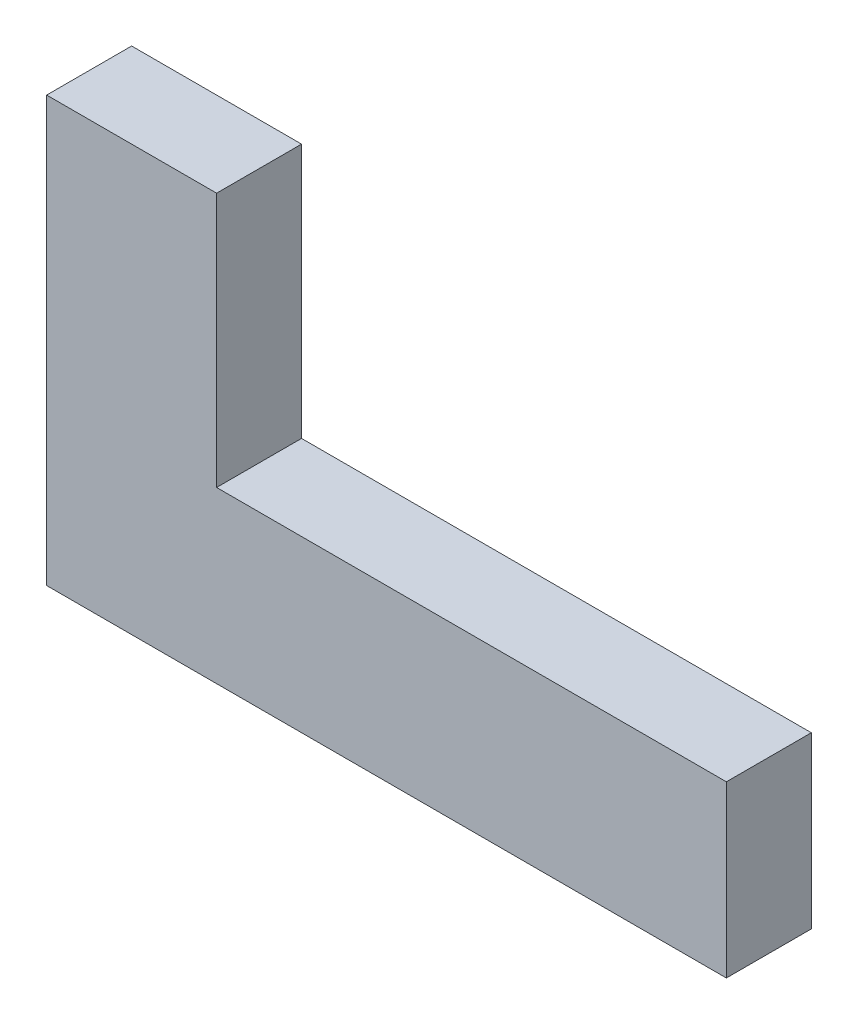
ISO-10303-21;
HEADER;
FILE_DESCRIPTION(('STEP AP214'),'2;1');
FILE_NAME('part.step','',(''),(''),'','','');
FILE_SCHEMA(('AUTOMOTIVE_DESIGN { 1 0 10303 214 1 1 1 1 }'));
ENDSEC;
DATA;
#1=APPLICATION_CONTEXT('core data for automotive mechanical design processes');
#2=APPLICATION_PROTOCOL_DEFINITION('international standard','automotive_design',2000,#1);
#3=PRODUCT_CONTEXT('',#1,'mechanical');
#4=PRODUCT('Part','Part','',(#3));
#5=PRODUCT_RELATED_PRODUCT_CATEGORY('part','',(#4));
#6=PRODUCT_DEFINITION_FORMATION('','',#4);
#7=PRODUCT_DEFINITION_CONTEXT('part definition',#1,'design');
#8=PRODUCT_DEFINITION('design','',#6,#7);
#9=PRODUCT_DEFINITION_SHAPE('','',#8);
#10=(LENGTH_UNIT() NAMED_UNIT(*) SI_UNIT(.MILLI.,.METRE.));
#11=(NAMED_UNIT(*) PLANE_ANGLE_UNIT() SI_UNIT($,.RADIAN.));
#12=(NAMED_UNIT(*) SI_UNIT($,.STERADIAN.) SOLID_ANGLE_UNIT());
#13=UNCERTAINTY_MEASURE_WITH_UNIT(LENGTH_MEASURE(1.E-05),#10,'distance_accuracy_value','');
#14=(GEOMETRIC_REPRESENTATION_CONTEXT(3) GLOBAL_UNCERTAINTY_ASSIGNED_CONTEXT((#13)) GLOBAL_UNIT_ASSIGNED_CONTEXT((#10,
#11,#12)) REPRESENTATION_CONTEXT('',''));
#15=CARTESIAN_POINT('',(0.,0.,0.));
#16=DIRECTION('',(0.,0.,1.));
#17=DIRECTION('',(1.,0.,0.));
#18=AXIS2_PLACEMENT_3D('',#15,#16,#17);
#19=CARTESIAN_POINT('',(-53.0708661417323,38.8779527559055,10.));
#20=DIRECTION('',(0.,-1.,0.));
#21=DIRECTION('',(0.,0.,-1.));
#22=AXIS2_PLACEMENT_3D('',#19,#20,#21);
#23=PLANE('',#22);
#24=DIRECTION('',(-1.,0.,0.));
#25=VECTOR('',#24,1.);
#26=CARTESIAN_POINT('',(-53.0708661417323,38.8779527559055,0.));
#27=LINE('',#26,#25);
#28=CARTESIAN_POINT('',(-33.0708661417323,38.8779527559055,0.));
#29=VERTEX_POINT('',#28);
#30=CARTESIAN_POINT('',(-53.0708661417323,38.8779527559055,0.));
#31=VERTEX_POINT('',#30);
#32=EDGE_CURVE('E123',#29,#31,#27,.T.);
#33=ORIENTED_EDGE('',*,*,#32,.T.);
#34=DIRECTION('',(0.,0.,-1.));
#35=VECTOR('',#34,1.);
#36=CARTESIAN_POINT('',(-53.0708661417323,38.8779527559055,10.));
#37=LINE('',#36,#35);
#38=CARTESIAN_POINT('',(-53.0708661417323,38.8779527559055,10.));
#39=VERTEX_POINT('',#38);
#40=EDGE_CURVE('E11',#39,#31,#37,.T.);
#41=ORIENTED_EDGE('',*,*,#40,.F.);
#42=DIRECTION('',(-1.,0.,0.));
#43=VECTOR('',#42,1.);
#44=CARTESIAN_POINT('',(-53.0708661417323,38.8779527559055,10.));
#45=LINE('',#44,#43);
#46=CARTESIAN_POINT('',(-33.0708661417323,38.8779527559055,10.));
#47=VERTEX_POINT('',#46);
#48=EDGE_CURVE('E133',#47,#39,#45,.T.);
#49=ORIENTED_EDGE('',*,*,#48,.F.);
#50=DIRECTION('',(0.,0.,-1.));
#51=VECTOR('',#50,1.);
#52=CARTESIAN_POINT('',(-33.0708661417323,38.8779527559055,10.));
#53=LINE('',#52,#51);
#54=EDGE_CURVE('E119',#47,#29,#53,.T.);
#55=ORIENTED_EDGE('',*,*,#54,.T.);
#56=EDGE_LOOP('',(#33,#41,#49,#55));
#57=FACE_BOUND('',#56,.T.);
#58=ADVANCED_FACE('F39',(#57),#23,.F.);
#59=CARTESIAN_POINT('',(-53.0708661417323,38.8779527559055,10.));
#60=DIRECTION('',(1.,0.,0.));
#61=DIRECTION('',(0.,1.,0.));
#62=AXIS2_PLACEMENT_3D('',#59,#60,#61);
#63=PLANE('',#62);
#64=DIRECTION('',(0.,-1.,0.));
#65=VECTOR('',#64,1.);
#66=CARTESIAN_POINT('',(-53.0708661417323,38.8779527559055,0.));
#67=LINE('',#66,#65);
#68=CARTESIAN_POINT('',(-53.0708661417318,-11.1220472440945,0.));
#69=VERTEX_POINT('',#68);
#70=EDGE_CURVE('E126',#31,#69,#67,.T.);
#71=ORIENTED_EDGE('',*,*,#70,.T.);
#72=DIRECTION('',(0.,0.,-1.));
#73=VECTOR('',#72,1.);
#74=CARTESIAN_POINT('',(-53.0708661417318,-11.1220472440945,10.));
#75=LINE('',#74,#73);
#76=CARTESIAN_POINT('',(-53.0708661417318,-11.1220472440945,10.));
#77=VERTEX_POINT('',#76);
#78=EDGE_CURVE('E47',#77,#69,#75,.T.);
#79=ORIENTED_EDGE('',*,*,#78,.F.);
#80=DIRECTION('',(0.,-1.,0.));
#81=VECTOR('',#80,1.);
#82=CARTESIAN_POINT('',(-53.0708661417323,38.8779527559055,10.));
#83=LINE('',#82,#81);
#84=EDGE_CURVE('E92',#39,#77,#83,.T.);
#85=ORIENTED_EDGE('',*,*,#84,.F.);
#86=ORIENTED_EDGE('',*,*,#40,.T.);
#87=EDGE_LOOP('',(#71,#79,#85,#86));
#88=FACE_BOUND('',#87,.T.);
#89=ADVANCED_FACE('F157',(#88),#63,.F.);
#90=CARTESIAN_POINT('',(26.9291338582682,-11.1220472440945,10.));
#91=DIRECTION('',(0.,1.,0.));
#92=DIRECTION('',(-1.,0.,0.));
#93=AXIS2_PLACEMENT_3D('',#90,#91,#92);
#94=PLANE('',#93);
#95=DIRECTION('',(1.,0.,0.));
#96=VECTOR('',#95,1.);
#97=CARTESIAN_POINT('',(26.9291338582682,-11.1220472440945,0.));
#98=LINE('',#97,#96);
#99=CARTESIAN_POINT('',(26.9291338582682,-11.1220472440945,0.));
#100=VERTEX_POINT('',#99);
#101=EDGE_CURVE('E128',#69,#100,#98,.T.);
#102=ORIENTED_EDGE('',*,*,#101,.T.);
#103=DIRECTION('',(0.,0.,-1.));
#104=VECTOR('',#103,1.);
#105=CARTESIAN_POINT('',(26.9291338582682,-11.1220472440945,10.));
#106=LINE('',#105,#104);
#107=CARTESIAN_POINT('',(26.9291338582682,-11.1220472440945,10.));
#108=VERTEX_POINT('',#107);
#109=EDGE_CURVE('E114',#108,#100,#106,.T.);
#110=ORIENTED_EDGE('',*,*,#109,.F.);
#111=DIRECTION('',(1.,0.,0.));
#112=VECTOR('',#111,1.);
#113=CARTESIAN_POINT('',(26.9291338582682,-11.1220472440945,10.));
#114=LINE('',#113,#112);
#115=EDGE_CURVE('E105',#77,#108,#114,.T.);
#116=ORIENTED_EDGE('',*,*,#115,.F.);
#117=ORIENTED_EDGE('',*,*,#78,.T.);
#118=EDGE_LOOP('',(#102,#110,#116,#117));
#119=FACE_BOUND('',#118,.T.);
#120=ADVANCED_FACE('F139',(#119),#94,.F.);
#121=CARTESIAN_POINT('',(26.9291338582682,8.87795275590551,10.));
#122=DIRECTION('',(-1.,0.,0.));
#123=DIRECTION('',(0.,0.,1.));
#124=AXIS2_PLACEMENT_3D('',#121,#122,#123);
#125=PLANE('',#124);
#126=DIRECTION('',(0.,1.,0.));
#127=VECTOR('',#126,1.);
#128=CARTESIAN_POINT('',(26.9291338582682,8.87795275590551,0.));
#129=LINE('',#128,#127);
#130=CARTESIAN_POINT('',(26.9291338582682,8.87795275590551,0.));
#131=VERTEX_POINT('',#130);
#132=EDGE_CURVE('E113',#100,#131,#129,.T.);
#133=ORIENTED_EDGE('',*,*,#132,.T.);
#134=DIRECTION('',(0.,0.,-1.));
#135=VECTOR('',#134,1.);
#136=CARTESIAN_POINT('',(26.9291338582682,8.87795275590551,10.));
#137=LINE('',#136,#135);
#138=CARTESIAN_POINT('',(26.9291338582682,8.87795275590551,10.));
#139=VERTEX_POINT('',#138);
#140=EDGE_CURVE('E110',#139,#131,#137,.T.);
#141=ORIENTED_EDGE('',*,*,#140,.F.);
#142=DIRECTION('',(0.,1.,0.));
#143=VECTOR('',#142,1.);
#144=CARTESIAN_POINT('',(26.9291338582682,8.87795275590551,10.));
#145=LINE('',#144,#143);
#146=EDGE_CURVE('E99',#108,#139,#145,.T.);
#147=ORIENTED_EDGE('',*,*,#146,.F.);
#148=ORIENTED_EDGE('',*,*,#109,.T.);
#149=EDGE_LOOP('',(#133,#141,#147,#148));
#150=FACE_BOUND('',#149,.T.);
#151=ADVANCED_FACE('F111',(#150),#125,.F.);
#152=CARTESIAN_POINT('',(-33.0708661417323,8.87795275590551,10.));
#153=DIRECTION('',(0.,-1.,0.));
#154=DIRECTION('',(1.,0.,0.));
#155=AXIS2_PLACEMENT_3D('',#152,#153,#154);
#156=PLANE('',#155);
#157=DIRECTION('',(-1.,0.,0.));
#158=VECTOR('',#157,1.);
#159=CARTESIAN_POINT('',(-33.0708661417323,8.87795275590551,0.));
#160=LINE('',#159,#158);
#161=CARTESIAN_POINT('',(-33.0708661417323,8.87795275590551,0.));
#162=VERTEX_POINT('',#161);
#163=EDGE_CURVE('E78',#131,#162,#160,.T.);
#164=ORIENTED_EDGE('',*,*,#163,.T.);
#165=DIRECTION('',(0.,0.,-1.));
#166=VECTOR('',#165,1.);
#167=CARTESIAN_POINT('',(-33.0708661417323,8.87795275590551,10.));
#168=LINE('',#167,#166);
#169=CARTESIAN_POINT('',(-33.0708661417323,8.87795275590551,10.));
#170=VERTEX_POINT('',#169);
#171=EDGE_CURVE('E115',#170,#162,#168,.T.);
#172=ORIENTED_EDGE('',*,*,#171,.F.);
#173=DIRECTION('',(-1.,0.,0.));
#174=VECTOR('',#173,1.);
#175=CARTESIAN_POINT('',(-33.0708661417323,8.87795275590551,10.));
#176=LINE('',#175,#174);
#177=EDGE_CURVE('E103',#139,#170,#176,.T.);
#178=ORIENTED_EDGE('',*,*,#177,.F.);
#179=ORIENTED_EDGE('',*,*,#140,.T.);
#180=EDGE_LOOP('',(#164,#172,#178,#179));
#181=FACE_BOUND('',#180,.T.);
#182=ADVANCED_FACE('F117',(#181),#156,.F.);
#183=CARTESIAN_POINT('',(-33.0708661417323,38.8779527559055,10.));
#184=DIRECTION('',(-1.,0.,0.));
#185=DIRECTION('',(0.,-1.,0.));
#186=AXIS2_PLACEMENT_3D('',#183,#184,#185);
#187=PLANE('',#186);
#188=DIRECTION('',(0.,1.,0.));
#189=VECTOR('',#188,1.);
#190=CARTESIAN_POINT('',(-33.0708661417323,38.8779527559055,0.));
#191=LINE('',#190,#189);
#192=EDGE_CURVE('E84',#162,#29,#191,.T.);
#193=ORIENTED_EDGE('',*,*,#192,.T.);
#194=ORIENTED_EDGE('',*,*,#54,.F.);
#195=DIRECTION('',(0.,1.,0.));
#196=VECTOR('',#195,1.);
#197=CARTESIAN_POINT('',(-33.0708661417323,38.8779527559055,10.));
#198=LINE('',#197,#196);
#199=EDGE_CURVE('E55',#170,#47,#198,.T.);
#200=ORIENTED_EDGE('',*,*,#199,.F.);
#201=ORIENTED_EDGE('',*,*,#171,.T.);
#202=EDGE_LOOP('',(#193,#194,#200,#201));
#203=FACE_BOUND('',#202,.T.);
#204=ADVANCED_FACE('F146',(#203),#187,.F.);
#205=CARTESIAN_POINT('',(0.,0.,10.));
#206=DIRECTION('',(0.,0.,-1.));
#207=DIRECTION('',(-1.,0.,0.));
#208=AXIS2_PLACEMENT_3D('',#205,#206,#207);
#209=PLANE('',#208);
#210=ORIENTED_EDGE('',*,*,#48,.T.);
#211=ORIENTED_EDGE('',*,*,#84,.T.);
#212=ORIENTED_EDGE('',*,*,#115,.T.);
#213=ORIENTED_EDGE('',*,*,#146,.T.);
#214=ORIENTED_EDGE('',*,*,#177,.T.);
#215=ORIENTED_EDGE('',*,*,#199,.T.);
#216=EDGE_LOOP('',(#210,#211,#212,#213,#214,#215));
#217=FACE_BOUND('',#216,.T.);
#218=ADVANCED_FACE('F101',(#217),#209,.F.);
#219=CARTESIAN_POINT('',(0.,0.,0.));
#220=DIRECTION('',(0.,0.,-1.));
#221=DIRECTION('',(-1.,0.,0.));
#222=AXIS2_PLACEMENT_3D('',#219,#220,#221);
#223=PLANE('',#222);
#224=ORIENTED_EDGE('',*,*,#32,.F.);
#225=ORIENTED_EDGE('',*,*,#192,.F.);
#226=ORIENTED_EDGE('',*,*,#163,.F.);
#227=ORIENTED_EDGE('',*,*,#132,.F.);
#228=ORIENTED_EDGE('',*,*,#101,.F.);
#229=ORIENTED_EDGE('',*,*,#70,.F.);
#230=EDGE_LOOP('',(#224,#225,#226,#227,#228,#229));
#231=FACE_BOUND('',#230,.T.);
#232=ADVANCED_FACE('F142',(#231),#223,.T.);
#233=CLOSED_SHELL('',(#58,#89,#120,#151,#182,#204,#218,#232));
#234=MANIFOLD_SOLID_BREP('B2',#233);
#235=ADVANCED_BREP_SHAPE_REPRESENTATION('',(#18,#234),#14);
#236=SHAPE_DEFINITION_REPRESENTATION(#9,#235);
ENDSEC;
END-ISO-10303-21;
